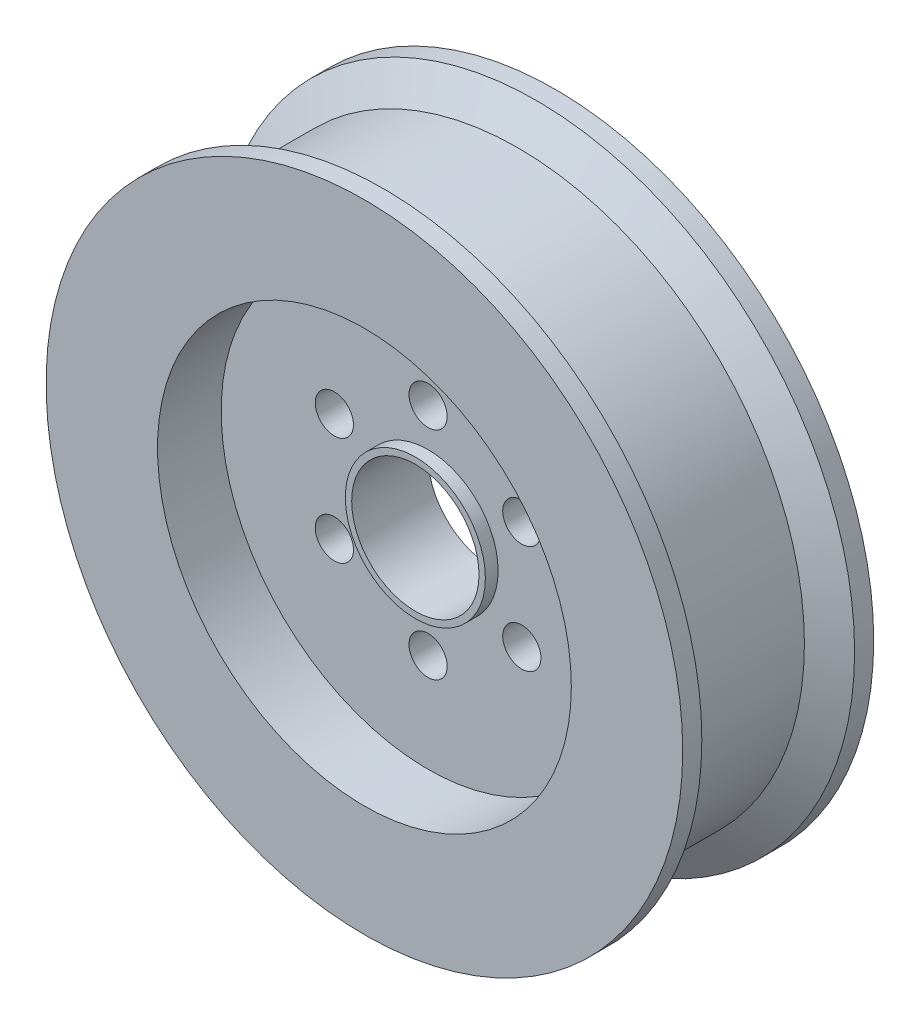
ISO-10303-21;
HEADER;
FILE_DESCRIPTION(('STEP AP214'),'2;1');
FILE_NAME('part.step','',(''),(''),'','','');
FILE_SCHEMA(('AUTOMOTIVE_DESIGN { 1 0 10303 214 1 1 1 1 }'));
ENDSEC;
DATA;
#1=APPLICATION_CONTEXT('core data for automotive mechanical design processes');
#2=APPLICATION_PROTOCOL_DEFINITION('international standard','automotive_design',2000,#1);
#3=PRODUCT_CONTEXT('',#1,'mechanical');
#4=PRODUCT('Part','Part','',(#3));
#5=PRODUCT_RELATED_PRODUCT_CATEGORY('part','',(#4));
#6=PRODUCT_DEFINITION_FORMATION('','',#4);
#7=PRODUCT_DEFINITION_CONTEXT('part definition',#1,'design');
#8=PRODUCT_DEFINITION('design','',#6,#7);
#9=PRODUCT_DEFINITION_SHAPE('','',#8);
#10=(LENGTH_UNIT() NAMED_UNIT(*) SI_UNIT(.MILLI.,.METRE.));
#11=(NAMED_UNIT(*) PLANE_ANGLE_UNIT() SI_UNIT($,.RADIAN.));
#12=(NAMED_UNIT(*) SI_UNIT($,.STERADIAN.) SOLID_ANGLE_UNIT());
#13=UNCERTAINTY_MEASURE_WITH_UNIT(LENGTH_MEASURE(1.E-05),#10,'distance_accuracy_value','');
#14=(GEOMETRIC_REPRESENTATION_CONTEXT(3) GLOBAL_UNCERTAINTY_ASSIGNED_CONTEXT((#13)) GLOBAL_UNIT_ASSIGNED_CONTEXT((#10,
#11,#12)) REPRESENTATION_CONTEXT('',''));
#15=CARTESIAN_POINT('',(0.,0.,0.));
#16=DIRECTION('',(0.,0.,1.));
#17=DIRECTION('',(1.,0.,0.));
#18=AXIS2_PLACEMENT_3D('',#15,#16,#17);
#19=CARTESIAN_POINT('',(0.,0.,15.));
#20=DIRECTION('',(0.,0.,-1.));
#21=DIRECTION('',(-1.,0.,0.));
#22=AXIS2_PLACEMENT_3D('',#19,#20,#21);
#23=CYLINDRICAL_SURFACE('',#22,50.);
#24=CARTESIAN_POINT('',(0.,0.,-12.));
#25=DIRECTION('',(0.,0.,1.));
#26=DIRECTION('',(1.,0.,0.));
#27=AXIS2_PLACEMENT_3D('',#24,#25,#26);
#28=CIRCLE('',#27,50.);
#29=CARTESIAN_POINT('',(50.,0.,-12.));
#30=VERTEX_POINT('',#29);
#31=EDGE_CURVE('E139',#30,#30,#28,.T.);
#32=ORIENTED_EDGE('',*,*,#31,.F.);
#33=EDGE_LOOP('',(#32));
#34=FACE_BOUND('',#33,.T.);
#35=CARTESIAN_POINT('',(0.,0.,-15.));
#36=DIRECTION('',(0.,0.,1.));
#37=DIRECTION('',(1.,0.,0.));
#38=AXIS2_PLACEMENT_3D('',#35,#36,#37);
#39=CIRCLE('',#38,50.);
#40=CARTESIAN_POINT('',(50.,0.,-15.));
#41=VERTEX_POINT('',#40);
#42=EDGE_CURVE('E64',#41,#41,#39,.T.);
#43=ORIENTED_EDGE('',*,*,#42,.T.);
#44=EDGE_LOOP('',(#43));
#45=FACE_BOUND('',#44,.T.);
#46=ADVANCED_FACE('F53',(#34,#45),#23,.T.);
#47=CARTESIAN_POINT('',(0.,0.,15.));
#48=DIRECTION('',(0.,0.,-1.));
#49=DIRECTION('',(-1.,0.,0.));
#50=AXIS2_PLACEMENT_3D('',#47,#48,#49);
#51=CYLINDRICAL_SURFACE('',#50,10.);
#52=CARTESIAN_POINT('',(0.,0.,7.));
#53=DIRECTION('',(0.,0.,1.));
#54=DIRECTION('',(1.,0.,0.));
#55=AXIS2_PLACEMENT_3D('',#52,#53,#54);
#56=CIRCLE('',#55,10.);
#57=CARTESIAN_POINT('',(10.,0.,7.));
#58=VERTEX_POINT('',#57);
#59=EDGE_CURVE('E142',#58,#58,#56,.T.);
#60=ORIENTED_EDGE('',*,*,#59,.T.);
#61=EDGE_LOOP('',(#60));
#62=FACE_BOUND('',#61,.T.);
#63=CARTESIAN_POINT('',(0.,0.,-5.));
#64=DIRECTION('',(0.,0.,-1.));
#65=DIRECTION('',(-1.,0.,0.));
#66=AXIS2_PLACEMENT_3D('',#63,#64,#65);
#67=CIRCLE('',#66,10.);
#68=CARTESIAN_POINT('',(-10.,0.,-5.));
#69=VERTEX_POINT('',#68);
#70=EDGE_CURVE('E74',#69,#69,#67,.T.);
#71=ORIENTED_EDGE('',*,*,#70,.T.);
#72=EDGE_LOOP('',(#71));
#73=FACE_BOUND('',#72,.T.);
#74=ADVANCED_FACE('F105',(#62,#73),#51,.F.);
#75=CARTESIAN_POINT('',(0.,0.,15.));
#76=DIRECTION('',(0.,0.,1.));
#77=DIRECTION('',(1.,0.,0.));
#78=AXIS2_PLACEMENT_3D('',#75,#76,#77);
#79=PLANE('',#78);
#80=CARTESIAN_POINT('',(0.,0.,15.));
#81=DIRECTION('',(0.,0.,1.));
#82=DIRECTION('',(1.,0.,0.));
#83=AXIS2_PLACEMENT_3D('',#80,#81,#82);
#84=CIRCLE('',#83,32.5);
#85=CARTESIAN_POINT('',(32.5,0.,15.));
#86=VERTEX_POINT('',#85);
#87=EDGE_CURVE('E72',#86,#86,#84,.T.);
#88=ORIENTED_EDGE('',*,*,#87,.F.);
#89=EDGE_LOOP('',(#88));
#90=FACE_BOUND('',#89,.T.);
#91=CARTESIAN_POINT('',(0.,0.,15.));
#92=DIRECTION('',(0.,0.,1.));
#93=DIRECTION('',(1.,0.,0.));
#94=AXIS2_PLACEMENT_3D('',#91,#92,#93);
#95=CIRCLE('',#94,50.);
#96=CARTESIAN_POINT('',(50.,0.,15.));
#97=VERTEX_POINT('',#96);
#98=EDGE_CURVE('E60',#97,#97,#95,.T.);
#99=ORIENTED_EDGE('',*,*,#98,.T.);
#100=EDGE_LOOP('',(#99));
#101=FACE_BOUND('',#100,.T.);
#102=ADVANCED_FACE('F102',(#90,#101),#79,.T.);
#103=CARTESIAN_POINT('',(0.,0.,-15.));
#104=DIRECTION('',(0.,0.,1.));
#105=DIRECTION('',(1.,0.,0.));
#106=AXIS2_PLACEMENT_3D('',#103,#104,#105);
#107=PLANE('',#106);
#108=CARTESIAN_POINT('',(0.,0.,-15.));
#109=DIRECTION('',(0.,0.,1.));
#110=DIRECTION('',(1.,0.,0.));
#111=AXIS2_PLACEMENT_3D('',#108,#109,#110);
#112=CIRCLE('',#111,32.5);
#113=CARTESIAN_POINT('',(32.5,0.,-15.));
#114=VERTEX_POINT('',#113);
#115=EDGE_CURVE('E81',#114,#114,#112,.T.);
#116=ORIENTED_EDGE('',*,*,#115,.T.);
#117=EDGE_LOOP('',(#116));
#118=FACE_BOUND('',#117,.T.);
#119=ORIENTED_EDGE('',*,*,#42,.F.);
#120=EDGE_LOOP('',(#119));
#121=FACE_BOUND('',#120,.T.);
#122=ADVANCED_FACE('F104',(#118,#121),#107,.F.);
#123=CARTESIAN_POINT('',(0.,0.,12.));
#124=DIRECTION('',(0.,0.,1.));
#125=DIRECTION('',(1.,0.,0.));
#126=AXIS2_PLACEMENT_3D('',#123,#124,#125);
#127=CIRCLE('',#126,50.);
#128=CARTESIAN_POINT('',(50.,0.,12.));
#129=VERTEX_POINT('',#128);
#130=EDGE_CURVE('E129',#129,#129,#127,.T.);
#131=ORIENTED_EDGE('',*,*,#130,.T.);
#132=EDGE_LOOP('',(#131));
#133=FACE_BOUND('',#132,.T.);
#134=ORIENTED_EDGE('',*,*,#98,.F.);
#135=EDGE_LOOP('',(#134));
#136=FACE_BOUND('',#135,.T.);
#137=ADVANCED_FACE('F55',(#133,#136),#23,.T.);
#138=CARTESIAN_POINT('',(0.,0.,5.));
#139=DIRECTION('',(0.,0.,1.));
#140=DIRECTION('',(1.,0.,0.));
#141=AXIS2_PLACEMENT_3D('',#138,#139,#140);
#142=CYLINDRICAL_SURFACE('',#141,32.5);
#143=CARTESIAN_POINT('',(0.,0.,5.));
#144=DIRECTION('',(0.,0.,1.));
#145=DIRECTION('',(1.,0.,0.));
#146=AXIS2_PLACEMENT_3D('',#143,#144,#145);
#147=CIRCLE('',#146,32.5);
#148=CARTESIAN_POINT('',(32.5,0.,5.));
#149=VERTEX_POINT('',#148);
#150=EDGE_CURVE('E69',#149,#149,#147,.T.);
#151=ORIENTED_EDGE('',*,*,#150,.F.);
#152=EDGE_LOOP('',(#151));
#153=FACE_BOUND('',#152,.T.);
#154=ORIENTED_EDGE('',*,*,#87,.T.);
#155=EDGE_LOOP('',(#154));
#156=FACE_BOUND('',#155,.T.);
#157=ADVANCED_FACE('F96',(#153,#156),#142,.F.);
#158=CARTESIAN_POINT('',(0.,0.,5.));
#159=DIRECTION('',(0.,0.,1.));
#160=DIRECTION('',(1.,0.,0.));
#161=AXIS2_PLACEMENT_3D('',#158,#159,#160);
#162=PLANE('',#161);
#163=CARTESIAN_POINT('',(0.,0.,5.));
#164=DIRECTION('',(0.,0.,1.));
#165=DIRECTION('',(1.,0.,0.));
#166=AXIS2_PLACEMENT_3D('',#163,#164,#165);
#167=CIRCLE('',#166,11.);
#168=CARTESIAN_POINT('',(11.,0.,5.));
#169=VERTEX_POINT('',#168);
#170=EDGE_CURVE('E11',#169,#169,#167,.T.);
#171=ORIENTED_EDGE('',*,*,#170,.F.);
#172=EDGE_LOOP('',(#171));
#173=FACE_BOUND('',#172,.T.);
#174=CARTESIAN_POINT('',(-14.7224318643354,8.50000000000017,5.));
#175=DIRECTION('',(0.,0.,1.));
#176=DIRECTION('',(0.50000000000001,0.866025403784433,0.));
#177=AXIS2_PLACEMENT_3D('',#174,#175,#176);
#178=CIRCLE('',#177,3.);
#179=CARTESIAN_POINT('',(-13.2224318643353,11.0980762113535,5.));
#180=VERTEX_POINT('',#179);
#181=EDGE_CURVE('E148',#180,#180,#178,.T.);
#182=ORIENTED_EDGE('',*,*,#181,.F.);
#183=EDGE_LOOP('',(#182));
#184=FACE_BOUND('',#183,.T.);
#185=CARTESIAN_POINT('',(-14.7224318643355,-8.49999999999986,5.));
#186=DIRECTION('',(0.,0.,1.));
#187=DIRECTION('',(-0.499999999999992,0.866025403784443,0.));
#188=AXIS2_PLACEMENT_3D('',#185,#186,#187);
#189=CIRCLE('',#188,3.);
#190=CARTESIAN_POINT('',(-16.2224318643355,-5.90192378864653,5.));
#191=VERTEX_POINT('',#190);
#192=EDGE_CURVE('E152',#191,#191,#189,.T.);
#193=ORIENTED_EDGE('',*,*,#192,.F.);
#194=EDGE_LOOP('',(#193));
#195=FACE_BOUND('',#194,.T.);
#196=CARTESIAN_POINT('',(0.,-17.,5.));
#197=DIRECTION('',(0.,0.,1.));
#198=DIRECTION('',(-1.,0.,0.));
#199=AXIS2_PLACEMENT_3D('',#196,#197,#198);
#200=CIRCLE('',#199,3.);
#201=CARTESIAN_POINT('',(-3.,-17.,5.));
#202=VERTEX_POINT('',#201);
#203=EDGE_CURVE('E158',#202,#202,#200,.T.);
#204=ORIENTED_EDGE('',*,*,#203,.F.);
#205=EDGE_LOOP('',(#204));
#206=FACE_BOUND('',#205,.T.);
#207=CARTESIAN_POINT('',(14.7224318643354,-8.50000000000007,5.));
#208=DIRECTION('',(0.,0.,1.));
#209=DIRECTION('',(-0.500000000000004,-0.866025403784436,0.));
#210=AXIS2_PLACEMENT_3D('',#207,#208,#209);
#211=CIRCLE('',#210,3.);
#212=CARTESIAN_POINT('',(13.2224318643354,-11.0980762113534,5.));
#213=VERTEX_POINT('',#212);
#214=EDGE_CURVE('E164',#213,#213,#211,.T.);
#215=ORIENTED_EDGE('',*,*,#214,.F.);
#216=EDGE_LOOP('',(#215));
#217=FACE_BOUND('',#216,.T.);
#218=CARTESIAN_POINT('',(14.7224318643355,8.49999999999997,5.));
#219=DIRECTION('',(0.,0.,1.));
#220=DIRECTION('',(0.499999999999998,-0.86602540378444,0.));
#221=AXIS2_PLACEMENT_3D('',#218,#219,#220);
#222=CIRCLE('',#221,3.);
#223=CARTESIAN_POINT('',(16.2224318643355,5.90192378864665,5.));
#224=VERTEX_POINT('',#223);
#225=EDGE_CURVE('E170',#224,#224,#222,.T.);
#226=ORIENTED_EDGE('',*,*,#225,.F.);
#227=EDGE_LOOP('',(#226));
#228=FACE_BOUND('',#227,.T.);
#229=CARTESIAN_POINT('',(0.,17.,5.));
#230=DIRECTION('',(0.,0.,1.));
#231=DIRECTION('',(1.,0.,0.));
#232=AXIS2_PLACEMENT_3D('',#229,#230,#231);
#233=CIRCLE('',#232,3.);
#234=CARTESIAN_POINT('',(3.,17.,5.));
#235=VERTEX_POINT('',#234);
#236=EDGE_CURVE('E89',#235,#235,#233,.T.);
#237=ORIENTED_EDGE('',*,*,#236,.F.);
#238=EDGE_LOOP('',(#237));
#239=FACE_BOUND('',#238,.T.);
#240=ORIENTED_EDGE('',*,*,#150,.T.);
#241=EDGE_LOOP('',(#240));
#242=FACE_BOUND('',#241,.T.);
#243=ADVANCED_FACE('F94',(#173,#184,#195,#206,#217,#228,#239,#242),#162,.T.);
#244=CARTESIAN_POINT('',(0.,0.,-5.));
#245=DIRECTION('',(0.,0.,-1.));
#246=DIRECTION('',(-1.,0.,0.));
#247=AXIS2_PLACEMENT_3D('',#244,#245,#246);
#248=CYLINDRICAL_SURFACE('',#247,32.5);
#249=CARTESIAN_POINT('',(0.,0.,-5.));
#250=DIRECTION('',(0.,0.,1.));
#251=DIRECTION('',(1.,0.,0.));
#252=AXIS2_PLACEMENT_3D('',#249,#250,#251);
#253=CIRCLE('',#252,32.5);
#254=CARTESIAN_POINT('',(32.5,0.,-5.));
#255=VERTEX_POINT('',#254);
#256=EDGE_CURVE('E76',#255,#255,#253,.T.);
#257=ORIENTED_EDGE('',*,*,#256,.T.);
#258=EDGE_LOOP('',(#257));
#259=FACE_BOUND('',#258,.T.);
#260=ORIENTED_EDGE('',*,*,#115,.F.);
#261=EDGE_LOOP('',(#260));
#262=FACE_BOUND('',#261,.T.);
#263=ADVANCED_FACE('F186',(#259,#262),#248,.F.);
#264=CARTESIAN_POINT('',(0.,0.,-5.));
#265=DIRECTION('',(0.,0.,-1.));
#266=DIRECTION('',(1.,0.,0.));
#267=AXIS2_PLACEMENT_3D('',#264,#265,#266);
#268=PLANE('',#267);
#269=CARTESIAN_POINT('',(-14.7224318643354,8.50000000000017,-5.));
#270=DIRECTION('',(0.,0.,1.));
#271=DIRECTION('',(0.50000000000001,0.866025403784433,0.));
#272=AXIS2_PLACEMENT_3D('',#269,#270,#271);
#273=CIRCLE('',#272,3.);
#274=CARTESIAN_POINT('',(-13.2224318643353,11.0980762113535,-5.));
#275=VERTEX_POINT('',#274);
#276=EDGE_CURVE('E149',#275,#275,#273,.T.);
#277=ORIENTED_EDGE('',*,*,#276,.T.);
#278=EDGE_LOOP('',(#277));
#279=FACE_BOUND('',#278,.T.);
#280=CARTESIAN_POINT('',(-14.7224318643355,-8.49999999999986,-5.));
#281=DIRECTION('',(0.,0.,1.));
#282=DIRECTION('',(-0.499999999999992,0.866025403784443,0.));
#283=AXIS2_PLACEMENT_3D('',#280,#281,#282);
#284=CIRCLE('',#283,3.);
#285=CARTESIAN_POINT('',(-16.2224318643355,-5.90192378864653,-5.));
#286=VERTEX_POINT('',#285);
#287=EDGE_CURVE('E155',#286,#286,#284,.T.);
#288=ORIENTED_EDGE('',*,*,#287,.T.);
#289=EDGE_LOOP('',(#288));
#290=FACE_BOUND('',#289,.T.);
#291=CARTESIAN_POINT('',(0.,-17.,-5.));
#292=DIRECTION('',(0.,0.,1.));
#293=DIRECTION('',(-1.,0.,0.));
#294=AXIS2_PLACEMENT_3D('',#291,#292,#293);
#295=CIRCLE('',#294,3.);
#296=CARTESIAN_POINT('',(-3.,-17.,-5.));
#297=VERTEX_POINT('',#296);
#298=EDGE_CURVE('E161',#297,#297,#295,.T.);
#299=ORIENTED_EDGE('',*,*,#298,.T.);
#300=EDGE_LOOP('',(#299));
#301=FACE_BOUND('',#300,.T.);
#302=CARTESIAN_POINT('',(14.7224318643354,-8.50000000000007,-5.));
#303=DIRECTION('',(0.,0.,1.));
#304=DIRECTION('',(-0.500000000000004,-0.866025403784436,0.));
#305=AXIS2_PLACEMENT_3D('',#302,#303,#304);
#306=CIRCLE('',#305,3.);
#307=CARTESIAN_POINT('',(13.2224318643354,-11.0980762113534,-5.));
#308=VERTEX_POINT('',#307);
#309=EDGE_CURVE('E167',#308,#308,#306,.T.);
#310=ORIENTED_EDGE('',*,*,#309,.T.);
#311=EDGE_LOOP('',(#310));
#312=FACE_BOUND('',#311,.T.);
#313=CARTESIAN_POINT('',(14.7224318643355,8.49999999999997,-5.));
#314=DIRECTION('',(0.,0.,1.));
#315=DIRECTION('',(0.499999999999998,-0.86602540378444,0.));
#316=AXIS2_PLACEMENT_3D('',#313,#314,#315);
#317=CIRCLE('',#316,3.);
#318=CARTESIAN_POINT('',(16.2224318643355,5.90192378864665,-5.));
#319=VERTEX_POINT('',#318);
#320=EDGE_CURVE('E173',#319,#319,#317,.T.);
#321=ORIENTED_EDGE('',*,*,#320,.T.);
#322=EDGE_LOOP('',(#321));
#323=FACE_BOUND('',#322,.T.);
#324=CARTESIAN_POINT('',(0.,17.,-5.));
#325=DIRECTION('',(0.,0.,1.));
#326=DIRECTION('',(1.,0.,0.));
#327=AXIS2_PLACEMENT_3D('',#324,#325,#326);
#328=CIRCLE('',#327,3.);
#329=CARTESIAN_POINT('',(3.,17.,-5.));
#330=VERTEX_POINT('',#329);
#331=EDGE_CURVE('E86',#330,#330,#328,.T.);
#332=ORIENTED_EDGE('',*,*,#331,.T.);
#333=EDGE_LOOP('',(#332));
#334=FACE_BOUND('',#333,.T.);
#335=ORIENTED_EDGE('',*,*,#70,.F.);
#336=EDGE_LOOP('',(#335));
#337=FACE_BOUND('',#336,.T.);
#338=ORIENTED_EDGE('',*,*,#256,.F.);
#339=EDGE_LOOP('',(#338));
#340=FACE_BOUND('',#339,.T.);
#341=ADVANCED_FACE('F193',(#279,#290,#301,#312,#323,#334,#337,#340),#268,.T.);
#342=CARTESIAN_POINT('',(0.,17.,-5.));
#343=DIRECTION('',(0.,0.,1.));
#344=DIRECTION('',(1.,0.,0.));
#345=AXIS2_PLACEMENT_3D('',#342,#343,#344);
#346=CYLINDRICAL_SURFACE('',#345,3.);
#347=ORIENTED_EDGE('',*,*,#331,.F.);
#348=EDGE_LOOP('',(#347));
#349=FACE_BOUND('',#348,.T.);
#350=ORIENTED_EDGE('',*,*,#236,.T.);
#351=EDGE_LOOP('',(#350));
#352=FACE_BOUND('',#351,.T.);
#353=ADVANCED_FACE('F183',(#349,#352),#346,.F.);
#354=CARTESIAN_POINT('',(14.7224318643355,8.49999999999997,-5.));
#355=DIRECTION('',(0.,0.,1.));
#356=DIRECTION('',(1.,0.,0.));
#357=AXIS2_PLACEMENT_3D('',#354,#355,#356);
#358=CYLINDRICAL_SURFACE('',#357,3.);
#359=ORIENTED_EDGE('',*,*,#320,.F.);
#360=EDGE_LOOP('',(#359));
#361=FACE_BOUND('',#360,.T.);
#362=ORIENTED_EDGE('',*,*,#225,.T.);
#363=EDGE_LOOP('',(#362));
#364=FACE_BOUND('',#363,.T.);
#365=ADVANCED_FACE('F202',(#361,#364),#358,.F.);
#366=CARTESIAN_POINT('',(14.7224318643354,-8.50000000000007,-5.));
#367=DIRECTION('',(0.,0.,1.));
#368=DIRECTION('',(1.,0.,0.));
#369=AXIS2_PLACEMENT_3D('',#366,#367,#368);
#370=CYLINDRICAL_SURFACE('',#369,3.);
#371=ORIENTED_EDGE('',*,*,#309,.F.);
#372=EDGE_LOOP('',(#371));
#373=FACE_BOUND('',#372,.T.);
#374=ORIENTED_EDGE('',*,*,#214,.T.);
#375=EDGE_LOOP('',(#374));
#376=FACE_BOUND('',#375,.T.);
#377=ADVANCED_FACE('F206',(#373,#376),#370,.F.);
#378=CARTESIAN_POINT('',(0.,-17.,-5.));
#379=DIRECTION('',(0.,0.,1.));
#380=DIRECTION('',(1.,0.,0.));
#381=AXIS2_PLACEMENT_3D('',#378,#379,#380);
#382=CYLINDRICAL_SURFACE('',#381,3.);
#383=ORIENTED_EDGE('',*,*,#298,.F.);
#384=EDGE_LOOP('',(#383));
#385=FACE_BOUND('',#384,.T.);
#386=ORIENTED_EDGE('',*,*,#203,.T.);
#387=EDGE_LOOP('',(#386));
#388=FACE_BOUND('',#387,.T.);
#389=ADVANCED_FACE('F210',(#385,#388),#382,.F.);
#390=CARTESIAN_POINT('',(-14.7224318643355,-8.49999999999986,-5.));
#391=DIRECTION('',(0.,0.,1.));
#392=DIRECTION('',(1.,0.,0.));
#393=AXIS2_PLACEMENT_3D('',#390,#391,#392);
#394=CYLINDRICAL_SURFACE('',#393,3.);
#395=ORIENTED_EDGE('',*,*,#287,.F.);
#396=EDGE_LOOP('',(#395));
#397=FACE_BOUND('',#396,.T.);
#398=ORIENTED_EDGE('',*,*,#192,.T.);
#399=EDGE_LOOP('',(#398));
#400=FACE_BOUND('',#399,.T.);
#401=ADVANCED_FACE('F214',(#397,#400),#394,.F.);
#402=CARTESIAN_POINT('',(-14.7224318643354,8.50000000000017,-5.));
#403=DIRECTION('',(0.,0.,1.));
#404=DIRECTION('',(1.,0.,0.));
#405=AXIS2_PLACEMENT_3D('',#402,#403,#404);
#406=CYLINDRICAL_SURFACE('',#405,3.);
#407=ORIENTED_EDGE('',*,*,#276,.F.);
#408=EDGE_LOOP('',(#407));
#409=FACE_BOUND('',#408,.T.);
#410=ORIENTED_EDGE('',*,*,#181,.T.);
#411=EDGE_LOOP('',(#410));
#412=FACE_BOUND('',#411,.T.);
#413=ADVANCED_FACE('F218',(#409,#412),#406,.F.);
#414=CARTESIAN_POINT('',(0.,0.,-2.));
#415=DIRECTION('',(0.,0.,1.));
#416=DIRECTION('',(1.,0.,0.));
#417=AXIS2_PLACEMENT_3D('',#414,#415,#416);
#418=CYLINDRICAL_SURFACE('',#417,11.);
#419=ORIENTED_EDGE('',*,*,#170,.T.);
#420=EDGE_LOOP('',(#419));
#421=FACE_BOUND('',#420,.T.);
#422=CARTESIAN_POINT('',(0.,0.,7.));
#423=DIRECTION('',(0.,0.,1.));
#424=DIRECTION('',(1.,0.,0.));
#425=AXIS2_PLACEMENT_3D('',#422,#423,#424);
#426=CIRCLE('',#425,11.);
#427=CARTESIAN_POINT('',(11.,0.,7.));
#428=VERTEX_POINT('',#427);
#429=EDGE_CURVE('E145',#428,#428,#426,.T.);
#430=ORIENTED_EDGE('',*,*,#429,.F.);
#431=EDGE_LOOP('',(#430));
#432=FACE_BOUND('',#431,.T.);
#433=ADVANCED_FACE('F222',(#421,#432),#418,.T.);
#434=CARTESIAN_POINT('',(0.,0.,7.));
#435=DIRECTION('',(0.,0.,1.));
#436=DIRECTION('',(1.,0.,0.));
#437=AXIS2_PLACEMENT_3D('',#434,#435,#436);
#438=PLANE('',#437);
#439=ORIENTED_EDGE('',*,*,#429,.T.);
#440=EDGE_LOOP('',(#439));
#441=FACE_BOUND('',#440,.T.);
#442=ORIENTED_EDGE('',*,*,#59,.F.);
#443=EDGE_LOOP('',(#442));
#444=FACE_BOUND('',#443,.T.);
#445=ADVANCED_FACE('F225',(#441,#444),#438,.T.);
#446=CARTESIAN_POINT('',(0.,0.,-12.));
#447=DIRECTION('',(0.,0.,-1.));
#448=DIRECTION('',(-1.,0.,0.));
#449=AXIS2_PLACEMENT_3D('',#446,#447,#448);
#450=CONICAL_SURFACE('',#449,50.,1.04719755119659);
#451=CARTESIAN_POINT('',(0.,0.,-9.11324865405184));
#452=DIRECTION('',(0.,0.,1.));
#453=DIRECTION('',(1.,0.,0.));
#454=AXIS2_PLACEMENT_3D('',#451,#452,#453);
#455=CIRCLE('',#454,45.);
#456=CARTESIAN_POINT('',(45.,0.,-9.11324865405184));
#457=VERTEX_POINT('',#456);
#458=EDGE_CURVE('E134',#457,#457,#455,.T.);
#459=ORIENTED_EDGE('',*,*,#458,.F.);
#460=EDGE_LOOP('',(#459));
#461=FACE_BOUND('',#460,.T.);
#462=ORIENTED_EDGE('',*,*,#31,.T.);
#463=EDGE_LOOP('',(#462));
#464=FACE_BOUND('',#463,.T.);
#465=ADVANCED_FACE('F227',(#461,#464),#450,.T.);
#466=CARTESIAN_POINT('',(0.,0.,0.));
#467=DIRECTION('',(0.,0.,1.));
#468=DIRECTION('',(1.,0.,0.));
#469=AXIS2_PLACEMENT_3D('',#466,#467,#468);
#470=CYLINDRICAL_SURFACE('',#469,45.);
#471=CARTESIAN_POINT('',(0.,0.,9.11324865405184));
#472=DIRECTION('',(0.,0.,1.));
#473=DIRECTION('',(1.,0.,0.));
#474=AXIS2_PLACEMENT_3D('',#471,#472,#473);
#475=CIRCLE('',#474,45.);
#476=CARTESIAN_POINT('',(45.,0.,9.11324865405184));
#477=VERTEX_POINT('',#476);
#478=EDGE_CURVE('E131',#477,#477,#475,.T.);
#479=ORIENTED_EDGE('',*,*,#478,.F.);
#480=EDGE_LOOP('',(#479));
#481=FACE_BOUND('',#480,.T.);
#482=ORIENTED_EDGE('',*,*,#458,.T.);
#483=EDGE_LOOP('',(#482));
#484=FACE_BOUND('',#483,.T.);
#485=ADVANCED_FACE('F230',(#481,#484),#470,.T.);
#486=CARTESIAN_POINT('',(0.,0.,9.11324865405184));
#487=DIRECTION('',(0.,0.,1.));
#488=DIRECTION('',(1.,0.,0.));
#489=AXIS2_PLACEMENT_3D('',#486,#487,#488);
#490=CONICAL_SURFACE('',#489,45.,1.04719755119659);
#491=ORIENTED_EDGE('',*,*,#130,.F.);
#492=EDGE_LOOP('',(#491));
#493=FACE_BOUND('',#492,.T.);
#494=ORIENTED_EDGE('',*,*,#478,.T.);
#495=EDGE_LOOP('',(#494));
#496=FACE_BOUND('',#495,.T.);
#497=ADVANCED_FACE('F234',(#493,#496),#490,.T.);
#498=CLOSED_SHELL('',(#46,#74,#102,#122,#137,#157,#243,#263,#341,#353,#365,#377,#389,#401,#413,
#433,#445,#465,#485,#497));
#499=MANIFOLD_SOLID_BREP('B2',#498);
#500=ADVANCED_BREP_SHAPE_REPRESENTATION('',(#18,#499),#14);
#501=SHAPE_DEFINITION_REPRESENTATION(#9,#500);
ENDSEC;
END-ISO-10303-21;
